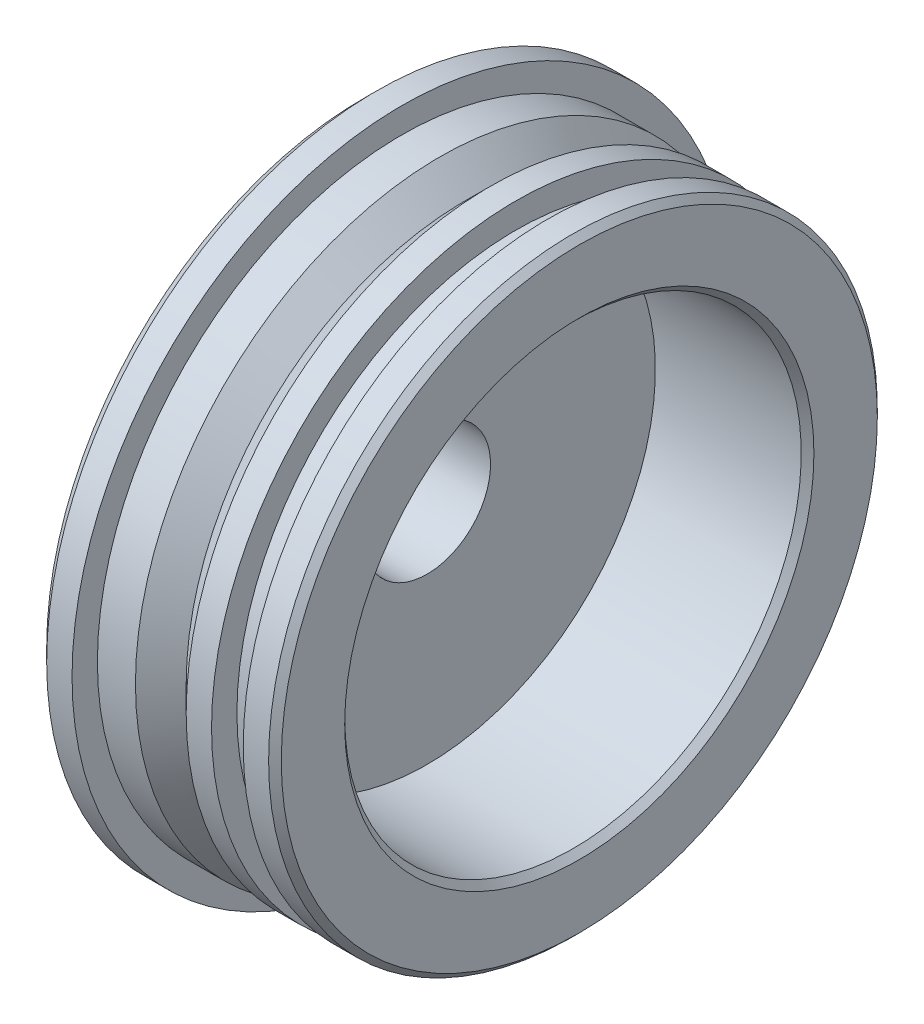
ISO-10303-21;
HEADER;
FILE_DESCRIPTION(('STEP AP214'),'2;1');
FILE_NAME('part.step','',(''),(''),'','','');
FILE_SCHEMA(('AUTOMOTIVE_DESIGN { 1 0 10303 214 1 1 1 1 }'));
ENDSEC;
DATA;
#1=APPLICATION_CONTEXT('core data for automotive mechanical design processes');
#2=APPLICATION_PROTOCOL_DEFINITION('international standard','automotive_design',2000,#1);
#3=PRODUCT_CONTEXT('',#1,'mechanical');
#4=PRODUCT('Part','Part','',(#3));
#5=PRODUCT_RELATED_PRODUCT_CATEGORY('part','',(#4));
#6=PRODUCT_DEFINITION_FORMATION('','',#4);
#7=PRODUCT_DEFINITION_CONTEXT('part definition',#1,'design');
#8=PRODUCT_DEFINITION('design','',#6,#7);
#9=PRODUCT_DEFINITION_SHAPE('','',#8);
#10=(LENGTH_UNIT() NAMED_UNIT(*) SI_UNIT(.MILLI.,.METRE.));
#11=(NAMED_UNIT(*) PLANE_ANGLE_UNIT() SI_UNIT($,.RADIAN.));
#12=(NAMED_UNIT(*) SI_UNIT($,.STERADIAN.) SOLID_ANGLE_UNIT());
#13=UNCERTAINTY_MEASURE_WITH_UNIT(LENGTH_MEASURE(1.E-05),#10,'distance_accuracy_value','');
#14=(GEOMETRIC_REPRESENTATION_CONTEXT(3) GLOBAL_UNCERTAINTY_ASSIGNED_CONTEXT((#13)) GLOBAL_UNIT_ASSIGNED_CONTEXT((#10,
#11,#12)) REPRESENTATION_CONTEXT('',''));
#15=CARTESIAN_POINT('',(0.,0.,0.));
#16=DIRECTION('',(0.,0.,1.));
#17=DIRECTION('',(1.,0.,0.));
#18=AXIS2_PLACEMENT_3D('',#15,#16,#17);
#19=CARTESIAN_POINT('',(-5.,0.,0.));
#20=DIRECTION('',(1.,0.,0.));
#21=DIRECTION('',(0.,0.,-1.));
#22=AXIS2_PLACEMENT_3D('',#19,#20,#21);
#23=PLANE('',#22);
#24=CARTESIAN_POINT('',(-5.,0.,0.));
#25=DIRECTION('',(-1.,0.,0.));
#26=DIRECTION('',(0.,0.,1.));
#27=AXIS2_PLACEMENT_3D('',#24,#25,#26);
#28=CIRCLE('',#27,5.);
#29=CARTESIAN_POINT('',(-5.,0.,5.));
#30=VERTEX_POINT('',#29);
#31=EDGE_CURVE('E90',#30,#30,#28,.T.);
#32=ORIENTED_EDGE('',*,*,#31,.F.);
#33=EDGE_LOOP('',(#32));
#34=FACE_BOUND('',#33,.T.);
#35=CARTESIAN_POINT('',(-5.,0.,0.));
#36=DIRECTION('',(-1.,0.,0.));
#37=DIRECTION('',(0.,0.,1.));
#38=AXIS2_PLACEMENT_3D('',#35,#36,#37);
#39=CIRCLE('',#38,25.);
#40=CARTESIAN_POINT('',(-5.,0.,25.));
#41=VERTEX_POINT('',#40);
#42=EDGE_CURVE('E10',#41,#41,#39,.T.);
#43=ORIENTED_EDGE('',*,*,#42,.T.);
#44=EDGE_LOOP('',(#43));
#45=FACE_BOUND('',#44,.T.);
#46=ADVANCED_FACE('F35',(#34,#45),#23,.F.);
#47=CARTESIAN_POINT('',(-4.,0.,0.));
#48=DIRECTION('',(1.,0.,0.));
#49=DIRECTION('',(0.,0.,-1.));
#50=AXIS2_PLACEMENT_3D('',#47,#48,#49);
#51=CONICAL_SURFACE('',#50,26.,0.785398163397448);
#52=ORIENTED_EDGE('',*,*,#42,.F.);
#53=EDGE_LOOP('',(#52));
#54=FACE_BOUND('',#53,.T.);
#55=CARTESIAN_POINT('',(-4.,0.,0.));
#56=DIRECTION('',(-1.,0.,0.));
#57=DIRECTION('',(0.,0.,1.));
#58=AXIS2_PLACEMENT_3D('',#55,#56,#57);
#59=CIRCLE('',#58,26.);
#60=CARTESIAN_POINT('',(-4.,0.,26.));
#61=VERTEX_POINT('',#60);
#62=EDGE_CURVE('E42',#61,#61,#59,.T.);
#63=ORIENTED_EDGE('',*,*,#62,.T.);
#64=EDGE_LOOP('',(#63));
#65=FACE_BOUND('',#64,.T.);
#66=ADVANCED_FACE('F109',(#54,#65),#51,.T.);
#67=CARTESIAN_POINT('',(0.,0.,0.));
#68=DIRECTION('',(-1.,0.,0.));
#69=DIRECTION('',(0.,0.,1.));
#70=AXIS2_PLACEMENT_3D('',#67,#68,#69);
#71=CYLINDRICAL_SURFACE('',#70,26.);
#72=ORIENTED_EDGE('',*,*,#62,.F.);
#73=EDGE_LOOP('',(#72));
#74=FACE_BOUND('',#73,.T.);
#75=CARTESIAN_POINT('',(-2.,0.,0.));
#76=DIRECTION('',(-1.,0.,0.));
#77=DIRECTION('',(0.,0.,1.));
#78=AXIS2_PLACEMENT_3D('',#75,#76,#77);
#79=CIRCLE('',#78,26.);
#80=CARTESIAN_POINT('',(-2.,0.,26.));
#81=VERTEX_POINT('',#80);
#82=EDGE_CURVE('E46',#81,#81,#79,.T.);
#83=ORIENTED_EDGE('',*,*,#82,.T.);
#84=EDGE_LOOP('',(#83));
#85=FACE_BOUND('',#84,.T.);
#86=ADVANCED_FACE('F114',(#74,#85),#71,.T.);
#87=CARTESIAN_POINT('',(-2.,26.,0.));
#88=DIRECTION('',(-1.,0.,0.));
#89=DIRECTION('',(0.,0.,1.));
#90=AXIS2_PLACEMENT_3D('',#87,#88,#89);
#91=PLANE('',#90);
#92=ORIENTED_EDGE('',*,*,#82,.F.);
#93=EDGE_LOOP('',(#92));
#94=FACE_BOUND('',#93,.T.);
#95=CARTESIAN_POINT('',(-2.,0.,0.));
#96=DIRECTION('',(-1.,0.,0.));
#97=DIRECTION('',(0.,0.,1.));
#98=AXIS2_PLACEMENT_3D('',#95,#96,#97);
#99=CIRCLE('',#98,24.);
#100=CARTESIAN_POINT('',(-2.,0.,24.));
#101=VERTEX_POINT('',#100);
#102=EDGE_CURVE('E51',#101,#101,#99,.T.);
#103=ORIENTED_EDGE('',*,*,#102,.T.);
#104=EDGE_LOOP('',(#103));
#105=FACE_BOUND('',#104,.T.);
#106=ADVANCED_FACE('F119',(#94,#105),#91,.F.);
#107=CARTESIAN_POINT('',(0.,0.,0.));
#108=DIRECTION('',(-1.,0.,0.));
#109=DIRECTION('',(0.,0.,1.));
#110=AXIS2_PLACEMENT_3D('',#107,#108,#109);
#111=CYLINDRICAL_SURFACE('',#110,24.);
#112=ORIENTED_EDGE('',*,*,#102,.F.);
#113=EDGE_LOOP('',(#112));
#114=FACE_BOUND('',#113,.T.);
#115=CARTESIAN_POINT('',(1.00000000000001,0.,0.));
#116=DIRECTION('',(-1.,0.,0.));
#117=DIRECTION('',(0.,0.,1.));
#118=AXIS2_PLACEMENT_3D('',#115,#116,#117);
#119=CIRCLE('',#118,24.);
#120=CARTESIAN_POINT('',(1.00000000000001,0.,24.));
#121=VERTEX_POINT('',#120);
#122=EDGE_CURVE('E54',#121,#121,#119,.T.);
#123=ORIENTED_EDGE('',*,*,#122,.T.);
#124=EDGE_LOOP('',(#123));
#125=FACE_BOUND('',#124,.T.);
#126=ADVANCED_FACE('F126',(#114,#125),#111,.T.);
#127=CARTESIAN_POINT('',(3.,0.,0.));
#128=DIRECTION('',(-1.,0.,0.));
#129=DIRECTION('',(0.,0.,1.));
#130=AXIS2_PLACEMENT_3D('',#127,#128,#129);
#131=CONICAL_SURFACE('',#130,22.,0.785398163397451);
#132=ORIENTED_EDGE('',*,*,#122,.F.);
#133=EDGE_LOOP('',(#132));
#134=FACE_BOUND('',#133,.T.);
#135=CARTESIAN_POINT('',(3.,0.,0.));
#136=DIRECTION('',(-1.,0.,0.));
#137=DIRECTION('',(0.,0.,1.));
#138=AXIS2_PLACEMENT_3D('',#135,#136,#137);
#139=CIRCLE('',#138,22.);
#140=CARTESIAN_POINT('',(3.,0.,22.));
#141=VERTEX_POINT('',#140);
#142=EDGE_CURVE('E57',#141,#141,#139,.T.);
#143=ORIENTED_EDGE('',*,*,#142,.T.);
#144=EDGE_LOOP('',(#143));
#145=FACE_BOUND('',#144,.T.);
#146=ADVANCED_FACE('F130',(#134,#145),#131,.T.);
#147=CARTESIAN_POINT('',(5.00000000000001,0.,0.));
#148=DIRECTION('',(1.,0.,0.));
#149=DIRECTION('',(0.,0.,-1.));
#150=AXIS2_PLACEMENT_3D('',#147,#148,#149);
#151=CONICAL_SURFACE('',#150,24.,0.785398163397446);
#152=ORIENTED_EDGE('',*,*,#142,.F.);
#153=EDGE_LOOP('',(#152));
#154=FACE_BOUND('',#153,.T.);
#155=CARTESIAN_POINT('',(5.00000000000001,0.,0.));
#156=DIRECTION('',(-1.,0.,0.));
#157=DIRECTION('',(0.,0.,1.));
#158=AXIS2_PLACEMENT_3D('',#155,#156,#157);
#159=CIRCLE('',#158,24.);
#160=CARTESIAN_POINT('',(5.00000000000001,0.,24.));
#161=VERTEX_POINT('',#160);
#162=EDGE_CURVE('E60',#161,#161,#159,.T.);
#163=ORIENTED_EDGE('',*,*,#162,.T.);
#164=EDGE_LOOP('',(#163));
#165=FACE_BOUND('',#164,.T.);
#166=ADVANCED_FACE('F134',(#154,#165),#151,.T.);
#167=CARTESIAN_POINT('',(0.,0.,0.));
#168=DIRECTION('',(-1.,0.,0.));
#169=DIRECTION('',(0.,0.,1.));
#170=AXIS2_PLACEMENT_3D('',#167,#168,#169);
#171=CYLINDRICAL_SURFACE('',#170,24.);
#172=ORIENTED_EDGE('',*,*,#162,.F.);
#173=EDGE_LOOP('',(#172));
#174=FACE_BOUND('',#173,.T.);
#175=CARTESIAN_POINT('',(7.00000000000001,0.,0.));
#176=DIRECTION('',(-1.,0.,0.));
#177=DIRECTION('',(0.,0.,1.));
#178=AXIS2_PLACEMENT_3D('',#175,#176,#177);
#179=CIRCLE('',#178,24.);
#180=CARTESIAN_POINT('',(7.00000000000001,0.,24.));
#181=VERTEX_POINT('',#180);
#182=EDGE_CURVE('E63',#181,#181,#179,.T.);
#183=ORIENTED_EDGE('',*,*,#182,.T.);
#184=EDGE_LOOP('',(#183));
#185=FACE_BOUND('',#184,.T.);
#186=ADVANCED_FACE('F138',(#174,#185),#171,.T.);
#187=CARTESIAN_POINT('',(7.00000000000001,24.,0.));
#188=DIRECTION('',(-1.,0.,0.));
#189=DIRECTION('',(0.,0.,1.));
#190=AXIS2_PLACEMENT_3D('',#187,#188,#189);
#191=PLANE('',#190);
#192=ORIENTED_EDGE('',*,*,#182,.F.);
#193=EDGE_LOOP('',(#192));
#194=FACE_BOUND('',#193,.T.);
#195=CARTESIAN_POINT('',(7.00000000000001,0.,0.));
#196=DIRECTION('',(-1.,0.,0.));
#197=DIRECTION('',(0.,0.,1.));
#198=AXIS2_PLACEMENT_3D('',#195,#196,#197);
#199=CIRCLE('',#198,22.);
#200=CARTESIAN_POINT('',(7.00000000000001,0.,22.));
#201=VERTEX_POINT('',#200);
#202=EDGE_CURVE('E66',#201,#201,#199,.T.);
#203=ORIENTED_EDGE('',*,*,#202,.T.);
#204=EDGE_LOOP('',(#203));
#205=FACE_BOUND('',#204,.T.);
#206=ADVANCED_FACE('F142',(#194,#205),#191,.F.);
#207=CARTESIAN_POINT('',(0.,0.,0.));
#208=DIRECTION('',(-1.,0.,0.));
#209=DIRECTION('',(0.,0.,1.));
#210=AXIS2_PLACEMENT_3D('',#207,#208,#209);
#211=CYLINDRICAL_SURFACE('',#210,22.);
#212=ORIENTED_EDGE('',*,*,#202,.F.);
#213=EDGE_LOOP('',(#212));
#214=FACE_BOUND('',#213,.T.);
#215=CARTESIAN_POINT('',(9.50000000000001,0.,0.));
#216=DIRECTION('',(-1.,0.,0.));
#217=DIRECTION('',(0.,0.,1.));
#218=AXIS2_PLACEMENT_3D('',#215,#216,#217);
#219=CIRCLE('',#218,22.);
#220=CARTESIAN_POINT('',(9.50000000000001,0.,22.));
#221=VERTEX_POINT('',#220);
#222=EDGE_CURVE('E69',#221,#221,#219,.T.);
#223=ORIENTED_EDGE('',*,*,#222,.T.);
#224=EDGE_LOOP('',(#223));
#225=FACE_BOUND('',#224,.T.);
#226=ADVANCED_FACE('F146',(#214,#225),#211,.T.);
#227=CARTESIAN_POINT('',(9.50000000000001,22.,0.));
#228=DIRECTION('',(1.,0.,0.));
#229=DIRECTION('',(0.,0.,-1.));
#230=AXIS2_PLACEMENT_3D('',#227,#228,#229);
#231=PLANE('',#230);
#232=ORIENTED_EDGE('',*,*,#222,.F.);
#233=EDGE_LOOP('',(#232));
#234=FACE_BOUND('',#233,.T.);
#235=CARTESIAN_POINT('',(9.50000000000001,0.,0.));
#236=DIRECTION('',(-1.,0.,0.));
#237=DIRECTION('',(0.,0.,1.));
#238=AXIS2_PLACEMENT_3D('',#235,#236,#237);
#239=CIRCLE('',#238,24.);
#240=CARTESIAN_POINT('',(9.50000000000001,0.,24.));
#241=VERTEX_POINT('',#240);
#242=EDGE_CURVE('E72',#241,#241,#239,.T.);
#243=ORIENTED_EDGE('',*,*,#242,.T.);
#244=EDGE_LOOP('',(#243));
#245=FACE_BOUND('',#244,.T.);
#246=ADVANCED_FACE('F150',(#234,#245),#231,.F.);
#247=CARTESIAN_POINT('',(0.,0.,0.));
#248=DIRECTION('',(-1.,0.,0.));
#249=DIRECTION('',(0.,0.,1.));
#250=AXIS2_PLACEMENT_3D('',#247,#248,#249);
#251=CYLINDRICAL_SURFACE('',#250,24.);
#252=ORIENTED_EDGE('',*,*,#242,.F.);
#253=EDGE_LOOP('',(#252));
#254=FACE_BOUND('',#253,.T.);
#255=CARTESIAN_POINT('',(11.5,0.,0.));
#256=DIRECTION('',(-1.,0.,0.));
#257=DIRECTION('',(0.,0.,1.));
#258=AXIS2_PLACEMENT_3D('',#255,#256,#257);
#259=CIRCLE('',#258,24.);
#260=CARTESIAN_POINT('',(11.5,0.,24.));
#261=VERTEX_POINT('',#260);
#262=EDGE_CURVE('E75',#261,#261,#259,.T.);
#263=ORIENTED_EDGE('',*,*,#262,.T.);
#264=EDGE_LOOP('',(#263));
#265=FACE_BOUND('',#264,.T.);
#266=ADVANCED_FACE('F154',(#254,#265),#251,.T.);
#267=CARTESIAN_POINT('',(12.,0.,0.));
#268=DIRECTION('',(-1.,0.,0.));
#269=DIRECTION('',(0.,0.,1.));
#270=AXIS2_PLACEMENT_3D('',#267,#268,#269);
#271=CONICAL_SURFACE('',#270,23.5,0.78539816339745);
#272=ORIENTED_EDGE('',*,*,#262,.F.);
#273=EDGE_LOOP('',(#272));
#274=FACE_BOUND('',#273,.T.);
#275=CARTESIAN_POINT('',(12.,0.,0.));
#276=DIRECTION('',(-1.,0.,0.));
#277=DIRECTION('',(0.,0.,1.));
#278=AXIS2_PLACEMENT_3D('',#275,#276,#277);
#279=CIRCLE('',#278,23.5);
#280=CARTESIAN_POINT('',(12.,0.,23.5));
#281=VERTEX_POINT('',#280);
#282=EDGE_CURVE('E78',#281,#281,#279,.T.);
#283=ORIENTED_EDGE('',*,*,#282,.T.);
#284=EDGE_LOOP('',(#283));
#285=FACE_BOUND('',#284,.T.);
#286=ADVANCED_FACE('F158',(#274,#285),#271,.T.);
#287=CARTESIAN_POINT('',(12.,23.5,0.));
#288=DIRECTION('',(-1.,0.,0.));
#289=DIRECTION('',(0.,0.,1.));
#290=AXIS2_PLACEMENT_3D('',#287,#288,#289);
#291=PLANE('',#290);
#292=ORIENTED_EDGE('',*,*,#282,.F.);
#293=EDGE_LOOP('',(#292));
#294=FACE_BOUND('',#293,.T.);
#295=CARTESIAN_POINT('',(12.,0.,0.));
#296=DIRECTION('',(-1.,0.,0.));
#297=DIRECTION('',(0.,0.,1.));
#298=AXIS2_PLACEMENT_3D('',#295,#296,#297);
#299=CIRCLE('',#298,18.5);
#300=CARTESIAN_POINT('',(12.,0.,18.5));
#301=VERTEX_POINT('',#300);
#302=EDGE_CURVE('E81',#301,#301,#299,.T.);
#303=ORIENTED_EDGE('',*,*,#302,.T.);
#304=EDGE_LOOP('',(#303));
#305=FACE_BOUND('',#304,.T.);
#306=ADVANCED_FACE('F162',(#294,#305),#291,.F.);
#307=CARTESIAN_POINT('',(11.5,0.,0.));
#308=DIRECTION('',(1.,0.,0.));
#309=DIRECTION('',(0.,0.,-1.));
#310=AXIS2_PLACEMENT_3D('',#307,#308,#309);
#311=CONICAL_SURFACE('',#310,18.,0.785398163397448);
#312=ORIENTED_EDGE('',*,*,#302,.F.);
#313=EDGE_LOOP('',(#312));
#314=FACE_BOUND('',#313,.T.);
#315=CARTESIAN_POINT('',(11.5,0.,0.));
#316=DIRECTION('',(-1.,0.,0.));
#317=DIRECTION('',(0.,0.,1.));
#318=AXIS2_PLACEMENT_3D('',#315,#316,#317);
#319=CIRCLE('',#318,18.);
#320=CARTESIAN_POINT('',(11.5,0.,18.));
#321=VERTEX_POINT('',#320);
#322=EDGE_CURVE('E84',#321,#321,#319,.T.);
#323=ORIENTED_EDGE('',*,*,#322,.T.);
#324=EDGE_LOOP('',(#323));
#325=FACE_BOUND('',#324,.T.);
#326=ADVANCED_FACE('F166',(#314,#325),#311,.F.);
#327=CARTESIAN_POINT('',(0.,0.,0.));
#328=DIRECTION('',(-1.,0.,0.));
#329=DIRECTION('',(0.,0.,1.));
#330=AXIS2_PLACEMENT_3D('',#327,#328,#329);
#331=CYLINDRICAL_SURFACE('',#330,18.);
#332=ORIENTED_EDGE('',*,*,#322,.F.);
#333=EDGE_LOOP('',(#332));
#334=FACE_BOUND('',#333,.T.);
#335=CARTESIAN_POINT('',(0.,0.,0.));
#336=DIRECTION('',(-1.,0.,0.));
#337=DIRECTION('',(0.,0.,1.));
#338=AXIS2_PLACEMENT_3D('',#335,#336,#337);
#339=CIRCLE('',#338,18.);
#340=CARTESIAN_POINT('',(0.,0.,18.));
#341=VERTEX_POINT('',#340);
#342=EDGE_CURVE('E87',#341,#341,#339,.T.);
#343=ORIENTED_EDGE('',*,*,#342,.T.);
#344=EDGE_LOOP('',(#343));
#345=FACE_BOUND('',#344,.T.);
#346=ADVANCED_FACE('F106',(#334,#345),#331,.F.);
#347=CARTESIAN_POINT('',(0.,18.,0.));
#348=DIRECTION('',(-1.,0.,0.));
#349=DIRECTION('',(0.,0.,1.));
#350=AXIS2_PLACEMENT_3D('',#347,#348,#349);
#351=PLANE('',#350);
#352=CARTESIAN_POINT('',(0.,0.,0.));
#353=DIRECTION('',(-1.,0.,0.));
#354=DIRECTION('',(0.,0.,1.));
#355=AXIS2_PLACEMENT_3D('',#352,#353,#354);
#356=CIRCLE('',#355,5.);
#357=CARTESIAN_POINT('',(0.,0.,5.));
#358=VERTEX_POINT('',#357);
#359=EDGE_CURVE('E38',#358,#358,#356,.T.);
#360=ORIENTED_EDGE('',*,*,#359,.T.);
#361=EDGE_LOOP('',(#360));
#362=FACE_BOUND('',#361,.T.);
#363=ORIENTED_EDGE('',*,*,#342,.F.);
#364=EDGE_LOOP('',(#363));
#365=FACE_BOUND('',#364,.T.);
#366=ADVANCED_FACE('F97',(#362,#365),#351,.F.);
#367=CARTESIAN_POINT('',(5.,0.,0.));
#368=DIRECTION('',(-1.,0.,0.));
#369=DIRECTION('',(0.,0.,1.));
#370=AXIS2_PLACEMENT_3D('',#367,#368,#369);
#371=CYLINDRICAL_SURFACE('',#370,5.);
#372=ORIENTED_EDGE('',*,*,#31,.T.);
#373=EDGE_LOOP('',(#372));
#374=FACE_BOUND('',#373,.T.);
#375=ORIENTED_EDGE('',*,*,#359,.F.);
#376=EDGE_LOOP('',(#375));
#377=FACE_BOUND('',#376,.T.);
#378=ADVANCED_FACE('F100',(#374,#377),#371,.F.);
#379=CLOSED_SHELL('',(#46,#66,#86,#106,#126,#146,#166,#186,#206,#226,#246,#266,#286,#306,#326,
#346,#366,#378));
#380=MANIFOLD_SOLID_BREP('B2',#379);
#381=ADVANCED_BREP_SHAPE_REPRESENTATION('',(#18,#380),#14);
#382=SHAPE_DEFINITION_REPRESENTATION(#9,#381);
ENDSEC;
END-ISO-10303-21;
